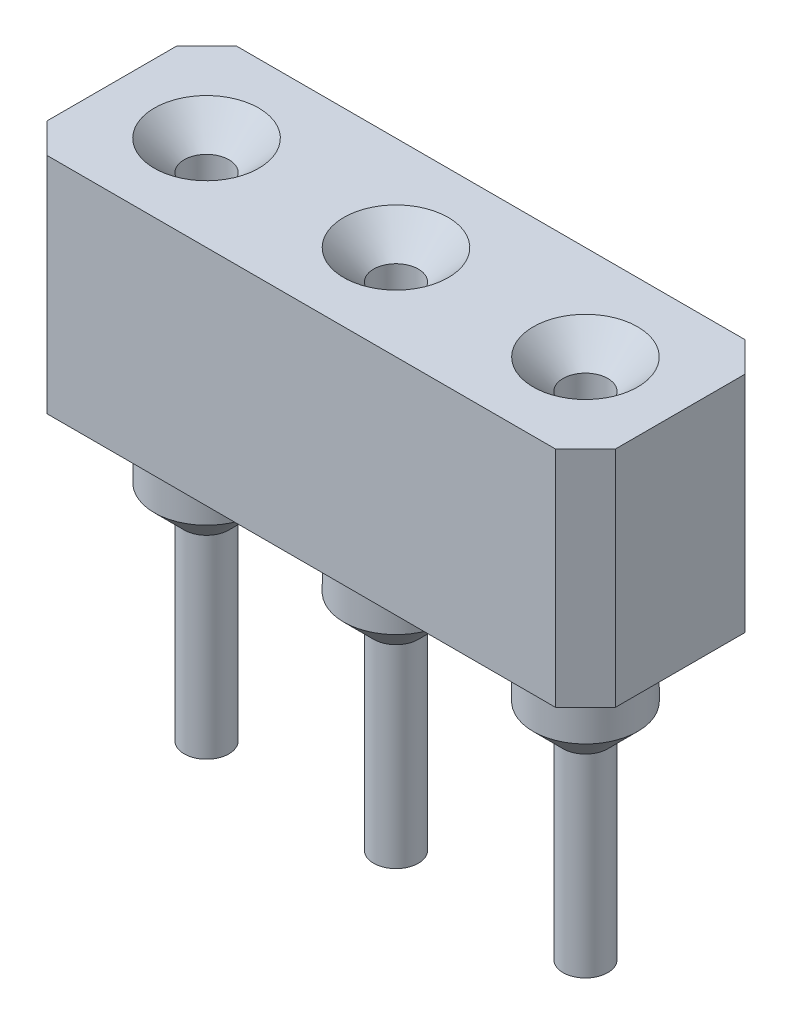
ISO-10303-21;
HEADER;
FILE_DESCRIPTION(('STEP AP214'),'2;1');
FILE_NAME('part.step','',(''),(''),'','','');
FILE_SCHEMA(('AUTOMOTIVE_DESIGN { 1 0 10303 214 1 1 1 1 }'));
ENDSEC;
DATA;
#1=APPLICATION_CONTEXT('core data for automotive mechanical design processes');
#2=APPLICATION_PROTOCOL_DEFINITION('international standard','automotive_design',2000,#1);
#3=PRODUCT_CONTEXT('',#1,'mechanical');
#4=PRODUCT('Part','Part','',(#3));
#5=PRODUCT_RELATED_PRODUCT_CATEGORY('part','',(#4));
#6=PRODUCT_DEFINITION_FORMATION('','',#4);
#7=PRODUCT_DEFINITION_CONTEXT('part definition',#1,'design');
#8=PRODUCT_DEFINITION('design','',#6,#7);
#9=PRODUCT_DEFINITION_SHAPE('','',#8);
#10=(LENGTH_UNIT() NAMED_UNIT(*) SI_UNIT(.MILLI.,.METRE.));
#11=(NAMED_UNIT(*) PLANE_ANGLE_UNIT() SI_UNIT($,.RADIAN.));
#12=(NAMED_UNIT(*) SI_UNIT($,.STERADIAN.) SOLID_ANGLE_UNIT());
#13=UNCERTAINTY_MEASURE_WITH_UNIT(LENGTH_MEASURE(1.E-05),#10,'distance_accuracy_value','');
#14=(GEOMETRIC_REPRESENTATION_CONTEXT(3) GLOBAL_UNCERTAINTY_ASSIGNED_CONTEXT((#13)) GLOBAL_UNIT_ASSIGNED_CONTEXT((#10,
#11,#12)) REPRESENTATION_CONTEXT('',''));
#15=CARTESIAN_POINT('',(0.,0.,0.));
#16=DIRECTION('',(0.,0.,1.));
#17=DIRECTION('',(1.,0.,0.));
#18=AXIS2_PLACEMENT_3D('',#15,#16,#17);
#19=CARTESIAN_POINT('',(-3.81,3.,1.27));
#20=DIRECTION('',(1.,0.,0.));
#21=DIRECTION('',(0.,0.,-1.));
#22=AXIS2_PLACEMENT_3D('',#19,#20,#21);
#23=PLANE('',#22);
#24=DIRECTION('',(0.,0.,1.));
#25=VECTOR('',#24,1.);
#26=CARTESIAN_POINT('',(-3.81,3.,1.27));
#27=LINE('',#26,#25);
#28=CARTESIAN_POINT('',(-3.81,3.,-0.869999999999997));
#29=VERTEX_POINT('',#28);
#30=CARTESIAN_POINT('',(-3.81,3.,0.869999999999998));
#31=VERTEX_POINT('',#30);
#32=EDGE_CURVE('E104',#29,#31,#27,.T.);
#33=ORIENTED_EDGE('',*,*,#32,.F.);
#34=DIRECTION('',(0.,-1.,0.));
#35=VECTOR('',#34,1.);
#36=CARTESIAN_POINT('',(-3.81,3.,-0.869999999999997));
#37=LINE('',#36,#35);
#38=CARTESIAN_POINT('',(-3.81,0.,-0.869999999999997));
#39=VERTEX_POINT('',#38);
#40=EDGE_CURVE('E11',#29,#39,#37,.T.);
#41=ORIENTED_EDGE('',*,*,#40,.T.);
#42=DIRECTION('',(0.,0.,1.));
#43=VECTOR('',#42,1.);
#44=CARTESIAN_POINT('',(-3.81,0.,1.27));
#45=LINE('',#44,#43);
#46=CARTESIAN_POINT('',(-3.81,0.,0.869999999999998));
#47=VERTEX_POINT('',#46);
#48=EDGE_CURVE('E332',#39,#47,#45,.T.);
#49=ORIENTED_EDGE('',*,*,#48,.T.);
#50=DIRECTION('',(0.,1.,0.));
#51=VECTOR('',#50,1.);
#52=CARTESIAN_POINT('',(-3.81,3.,0.869999999999998));
#53=LINE('',#52,#51);
#54=EDGE_CURVE('E40',#47,#31,#53,.T.);
#55=ORIENTED_EDGE('',*,*,#54,.T.);
#56=EDGE_LOOP('',(#33,#41,#49,#55));
#57=FACE_BOUND('',#56,.T.);
#58=ADVANCED_FACE('F32',(#57),#23,.F.);
#59=CARTESIAN_POINT('',(-3.81,3.,1.27));
#60=DIRECTION('',(0.,0.,-1.));
#61=DIRECTION('',(-1.,0.,0.));
#62=AXIS2_PLACEMENT_3D('',#59,#60,#61);
#63=PLANE('',#62);
#64=DIRECTION('',(1.,0.,0.));
#65=VECTOR('',#64,1.);
#66=CARTESIAN_POINT('',(-3.81,0.,1.27));
#67=LINE('',#66,#65);
#68=CARTESIAN_POINT('',(-3.41,0.,1.27));
#69=VERTEX_POINT('',#68);
#70=CARTESIAN_POINT('',(3.41,0.,1.27));
#71=VERTEX_POINT('',#70);
#72=EDGE_CURVE('E146',#69,#71,#67,.T.);
#73=ORIENTED_EDGE('',*,*,#72,.T.);
#74=DIRECTION('',(0.,1.,0.));
#75=VECTOR('',#74,1.);
#76=CARTESIAN_POINT('',(3.41,3.,1.27));
#77=LINE('',#76,#75);
#78=CARTESIAN_POINT('',(3.41,3.,1.27));
#79=VERTEX_POINT('',#78);
#80=EDGE_CURVE('E140',#71,#79,#77,.T.);
#81=ORIENTED_EDGE('',*,*,#80,.T.);
#82=DIRECTION('',(1.,0.,0.));
#83=VECTOR('',#82,1.);
#84=CARTESIAN_POINT('',(-3.81,3.,1.27));
#85=LINE('',#84,#83);
#86=CARTESIAN_POINT('',(-3.41,3.,1.27));
#87=VERTEX_POINT('',#86);
#88=EDGE_CURVE('E117',#87,#79,#85,.T.);
#89=ORIENTED_EDGE('',*,*,#88,.F.);
#90=DIRECTION('',(0.,-1.,0.));
#91=VECTOR('',#90,1.);
#92=CARTESIAN_POINT('',(-3.41,3.,1.27));
#93=LINE('',#92,#91);
#94=EDGE_CURVE('E138',#87,#69,#93,.T.);
#95=ORIENTED_EDGE('',*,*,#94,.T.);
#96=EDGE_LOOP('',(#73,#81,#89,#95));
#97=FACE_BOUND('',#96,.T.);
#98=ADVANCED_FACE('F145',(#97),#63,.F.);
#99=CARTESIAN_POINT('',(3.81,3.,1.27));
#100=DIRECTION('',(-1.,0.,0.));
#101=DIRECTION('',(0.,0.,1.));
#102=AXIS2_PLACEMENT_3D('',#99,#100,#101);
#103=PLANE('',#102);
#104=DIRECTION('',(0.,0.,-1.));
#105=VECTOR('',#104,1.);
#106=CARTESIAN_POINT('',(3.81,0.,1.27));
#107=LINE('',#106,#105);
#108=CARTESIAN_POINT('',(3.81,0.,0.869999999999999));
#109=VERTEX_POINT('',#108);
#110=CARTESIAN_POINT('',(3.81,0.,-0.870000000000001));
#111=VERTEX_POINT('',#110);
#112=EDGE_CURVE('E191',#109,#111,#107,.T.);
#113=ORIENTED_EDGE('',*,*,#112,.T.);
#114=DIRECTION('',(0.,1.,0.));
#115=VECTOR('',#114,1.);
#116=CARTESIAN_POINT('',(3.81,3.,-0.870000000000001));
#117=LINE('',#116,#115);
#118=CARTESIAN_POINT('',(3.81,3.,-0.870000000000001));
#119=VERTEX_POINT('',#118);
#120=EDGE_CURVE('E136',#111,#119,#117,.T.);
#121=ORIENTED_EDGE('',*,*,#120,.T.);
#122=DIRECTION('',(0.,0.,-1.));
#123=VECTOR('',#122,1.);
#124=CARTESIAN_POINT('',(3.81,3.,1.27));
#125=LINE('',#124,#123);
#126=CARTESIAN_POINT('',(3.81,3.,0.869999999999999));
#127=VERTEX_POINT('',#126);
#128=EDGE_CURVE('E150',#127,#119,#125,.T.);
#129=ORIENTED_EDGE('',*,*,#128,.F.);
#130=DIRECTION('',(0.,-1.,0.));
#131=VECTOR('',#130,1.);
#132=CARTESIAN_POINT('',(3.81,3.,0.869999999999999));
#133=LINE('',#132,#131);
#134=EDGE_CURVE('E133',#127,#109,#133,.T.);
#135=ORIENTED_EDGE('',*,*,#134,.T.);
#136=EDGE_LOOP('',(#113,#121,#129,#135));
#137=FACE_BOUND('',#136,.T.);
#138=ADVANCED_FACE('F234',(#137),#103,.F.);
#139=CARTESIAN_POINT('',(-3.81,3.,-1.27));
#140=DIRECTION('',(0.,0.,1.));
#141=DIRECTION('',(1.,0.,0.));
#142=AXIS2_PLACEMENT_3D('',#139,#140,#141);
#143=PLANE('',#142);
#144=DIRECTION('',(-1.,0.,0.));
#145=VECTOR('',#144,1.);
#146=CARTESIAN_POINT('',(-3.81,3.,-1.27));
#147=LINE('',#146,#145);
#148=CARTESIAN_POINT('',(3.41,3.,-1.27));
#149=VERTEX_POINT('',#148);
#150=CARTESIAN_POINT('',(-3.41,3.,-1.27));
#151=VERTEX_POINT('',#150);
#152=EDGE_CURVE('E107',#149,#151,#147,.T.);
#153=ORIENTED_EDGE('',*,*,#152,.F.);
#154=DIRECTION('',(0.,-1.,0.));
#155=VECTOR('',#154,1.);
#156=CARTESIAN_POINT('',(3.41,3.,-1.27));
#157=LINE('',#156,#155);
#158=CARTESIAN_POINT('',(3.41,0.,-1.27));
#159=VERTEX_POINT('',#158);
#160=EDGE_CURVE('E128',#149,#159,#157,.T.);
#161=ORIENTED_EDGE('',*,*,#160,.T.);
#162=DIRECTION('',(-1.,0.,0.));
#163=VECTOR('',#162,1.);
#164=CARTESIAN_POINT('',(-3.81,0.,-1.27));
#165=LINE('',#164,#163);
#166=CARTESIAN_POINT('',(-3.41,0.,-1.27));
#167=VERTEX_POINT('',#166);
#168=EDGE_CURVE('E118',#159,#167,#165,.T.);
#169=ORIENTED_EDGE('',*,*,#168,.T.);
#170=DIRECTION('',(0.,1.,0.));
#171=VECTOR('',#170,1.);
#172=CARTESIAN_POINT('',(-3.41,3.,-1.27));
#173=LINE('',#172,#171);
#174=EDGE_CURVE('E122',#167,#151,#173,.T.);
#175=ORIENTED_EDGE('',*,*,#174,.T.);
#176=EDGE_LOOP('',(#153,#161,#169,#175));
#177=FACE_BOUND('',#176,.T.);
#178=ADVANCED_FACE('F186',(#177),#143,.F.);
#179=CARTESIAN_POINT('',(0.,3.,0.));
#180=DIRECTION('',(0.,-1.,0.));
#181=DIRECTION('',(0.,0.,-1.));
#182=AXIS2_PLACEMENT_3D('',#179,#180,#181);
#183=PLANE('',#182);
#184=CARTESIAN_POINT('',(2.54,3.,0.));
#185=DIRECTION('',(0.,-1.,0.));
#186=DIRECTION('',(0.,0.,-1.));
#187=AXIS2_PLACEMENT_3D('',#184,#185,#186);
#188=CIRCLE('',#187,0.700000000000003);
#189=CARTESIAN_POINT('',(2.54,3.,-0.700000000000003));
#190=VERTEX_POINT('',#189);
#191=EDGE_CURVE('E165',#190,#190,#188,.T.);
#192=ORIENTED_EDGE('',*,*,#191,.T.);
#193=EDGE_LOOP('',(#192));
#194=FACE_BOUND('',#193,.T.);
#195=CARTESIAN_POINT('',(0.,3.,0.));
#196=DIRECTION('',(0.,-1.,0.));
#197=DIRECTION('',(0.,0.,-1.));
#198=AXIS2_PLACEMENT_3D('',#195,#196,#197);
#199=CIRCLE('',#198,0.700000000000003);
#200=CARTESIAN_POINT('',(0.,3.,-0.700000000000003));
#201=VERTEX_POINT('',#200);
#202=EDGE_CURVE('E162',#201,#201,#199,.T.);
#203=ORIENTED_EDGE('',*,*,#202,.T.);
#204=EDGE_LOOP('',(#203));
#205=FACE_BOUND('',#204,.T.);
#206=CARTESIAN_POINT('',(-2.54,3.,0.));
#207=DIRECTION('',(0.,-1.,0.));
#208=DIRECTION('',(0.,0.,-1.));
#209=AXIS2_PLACEMENT_3D('',#206,#207,#208);
#210=CIRCLE('',#209,0.700000000000003);
#211=CARTESIAN_POINT('',(-2.54,3.,-0.700000000000003));
#212=VERTEX_POINT('',#211);
#213=EDGE_CURVE('E156',#212,#212,#210,.T.);
#214=ORIENTED_EDGE('',*,*,#213,.T.);
#215=EDGE_LOOP('',(#214));
#216=FACE_BOUND('',#215,.T.);
#217=ORIENTED_EDGE('',*,*,#128,.T.);
#218=DIRECTION('',(0.707106781186548,0.,0.707106781186548));
#219=VECTOR('',#218,1.);
#220=CARTESIAN_POINT('',(3.41,3.,-1.27));
#221=LINE('',#220,#219);
#222=EDGE_CURVE('E154',#119,#149,#221,.F.);
#223=ORIENTED_EDGE('',*,*,#222,.T.);
#224=ORIENTED_EDGE('',*,*,#152,.T.);
#225=DIRECTION('',(0.707106781186548,0.,-0.707106781186547));
#226=VECTOR('',#225,1.);
#227=CARTESIAN_POINT('',(-3.81,3.,-0.869999999999997));
#228=LINE('',#227,#226);
#229=EDGE_CURVE('E100',#151,#29,#228,.F.);
#230=ORIENTED_EDGE('',*,*,#229,.T.);
#231=ORIENTED_EDGE('',*,*,#32,.T.);
#232=DIRECTION('',(-0.707106781186547,0.,-0.707106781186548));
#233=VECTOR('',#232,1.);
#234=CARTESIAN_POINT('',(-3.41,3.,1.27));
#235=LINE('',#234,#233);
#236=EDGE_CURVE('E112',#31,#87,#235,.F.);
#237=ORIENTED_EDGE('',*,*,#236,.T.);
#238=ORIENTED_EDGE('',*,*,#88,.T.);
#239=DIRECTION('',(-0.707106781186548,0.,0.707106781186547));
#240=VECTOR('',#239,1.);
#241=CARTESIAN_POINT('',(3.81,3.,0.869999999999999));
#242=LINE('',#241,#240);
#243=EDGE_CURVE('E111',#79,#127,#242,.F.);
#244=ORIENTED_EDGE('',*,*,#243,.T.);
#245=EDGE_LOOP('',(#217,#223,#224,#230,#231,#237,#238,#244));
#246=FACE_BOUND('',#245,.T.);
#247=ADVANCED_FACE('F103',(#194,#205,#216,#246),#183,.F.);
#248=CARTESIAN_POINT('',(0.,0.,0.));
#249=DIRECTION('',(0.,-1.,0.));
#250=DIRECTION('',(0.,0.,-1.));
#251=AXIS2_PLACEMENT_3D('',#248,#249,#250);
#252=PLANE('',#251);
#253=CARTESIAN_POINT('',(2.54,0.,0.));
#254=DIRECTION('',(0.,-1.,0.));
#255=DIRECTION('',(0.,0.,-1.));
#256=AXIS2_PLACEMENT_3D('',#253,#254,#255);
#257=CIRCLE('',#256,0.700000000000001);
#258=CARTESIAN_POINT('',(2.54,0.,-0.700000000000001));
#259=VERTEX_POINT('',#258);
#260=EDGE_CURVE('E202',#259,#259,#257,.T.);
#261=ORIENTED_EDGE('',*,*,#260,.F.);
#262=EDGE_LOOP('',(#261));
#263=FACE_BOUND('',#262,.T.);
#264=CARTESIAN_POINT('',(0.,0.,0.));
#265=DIRECTION('',(0.,-1.,0.));
#266=DIRECTION('',(0.,0.,-1.));
#267=AXIS2_PLACEMENT_3D('',#264,#265,#266);
#268=CIRCLE('',#267,0.700000000000001);
#269=CARTESIAN_POINT('',(0.,0.,-0.700000000000001));
#270=VERTEX_POINT('',#269);
#271=EDGE_CURVE('E199',#270,#270,#268,.T.);
#272=ORIENTED_EDGE('',*,*,#271,.F.);
#273=EDGE_LOOP('',(#272));
#274=FACE_BOUND('',#273,.T.);
#275=CARTESIAN_POINT('',(-2.54,0.,0.));
#276=DIRECTION('',(0.,-1.,0.));
#277=DIRECTION('',(0.,0.,-1.));
#278=AXIS2_PLACEMENT_3D('',#275,#276,#277);
#279=CIRCLE('',#278,0.7);
#280=CARTESIAN_POINT('',(-2.54,0.,-0.700000000000001));
#281=VERTEX_POINT('',#280);
#282=EDGE_CURVE('E196',#281,#281,#279,.T.);
#283=ORIENTED_EDGE('',*,*,#282,.F.);
#284=EDGE_LOOP('',(#283));
#285=FACE_BOUND('',#284,.T.);
#286=ORIENTED_EDGE('',*,*,#168,.F.);
#287=DIRECTION('',(-0.707106781186548,0.,-0.707106781186548));
#288=VECTOR('',#287,1.);
#289=CARTESIAN_POINT('',(2.34,0.,-2.34));
#290=LINE('',#289,#288);
#291=EDGE_CURVE('E126',#159,#111,#290,.F.);
#292=ORIENTED_EDGE('',*,*,#291,.T.);
#293=ORIENTED_EDGE('',*,*,#112,.F.);
#294=DIRECTION('',(0.707106781186548,0.,-0.707106781186547));
#295=VECTOR('',#294,1.);
#296=CARTESIAN_POINT('',(2.33999999999999,0.,2.34));
#297=LINE('',#296,#295);
#298=EDGE_CURVE('E47',#109,#71,#297,.F.);
#299=ORIENTED_EDGE('',*,*,#298,.T.);
#300=ORIENTED_EDGE('',*,*,#72,.F.);
#301=DIRECTION('',(0.707106781186547,0.,0.707106781186548));
#302=VECTOR('',#301,1.);
#303=CARTESIAN_POINT('',(-2.34,0.,2.34));
#304=LINE('',#303,#302);
#305=EDGE_CURVE('E55',#69,#47,#304,.F.);
#306=ORIENTED_EDGE('',*,*,#305,.T.);
#307=ORIENTED_EDGE('',*,*,#48,.F.);
#308=DIRECTION('',(-0.707106781186548,0.,0.707106781186547));
#309=VECTOR('',#308,1.);
#310=CARTESIAN_POINT('',(-2.33999999999999,0.,-2.34));
#311=LINE('',#310,#309);
#312=EDGE_CURVE('E121',#39,#167,#311,.F.);
#313=ORIENTED_EDGE('',*,*,#312,.T.);
#314=EDGE_LOOP('',(#286,#292,#293,#299,#300,#306,#307,#313));
#315=FACE_BOUND('',#314,.T.);
#316=ADVANCED_FACE('F189',(#263,#274,#285,#315),#252,.T.);
#317=CARTESIAN_POINT('',(0.,1.,0.));
#318=DIRECTION('',(0.,1.,0.));
#319=DIRECTION('',(0.,0.,1.));
#320=AXIS2_PLACEMENT_3D('',#317,#318,#319);
#321=CYLINDRICAL_SURFACE('',#320,0.3);
#322=CARTESIAN_POINT('',(0.,2.6,0.));
#323=DIRECTION('',(0.,-1.,0.));
#324=DIRECTION('',(0.,0.,-1.));
#325=AXIS2_PLACEMENT_3D('',#322,#323,#324);
#326=CIRCLE('',#325,0.3);
#327=CARTESIAN_POINT('',(0.,2.6,-0.3));
#328=VERTEX_POINT('',#327);
#329=EDGE_CURVE('E168',#328,#328,#326,.F.);
#330=ORIENTED_EDGE('',*,*,#329,.T.);
#331=EDGE_LOOP('',(#330));
#332=FACE_BOUND('',#331,.T.);
#333=CARTESIAN_POINT('',(0.,1.,0.));
#334=DIRECTION('',(0.,1.,0.));
#335=DIRECTION('',(0.,0.,1.));
#336=AXIS2_PLACEMENT_3D('',#333,#334,#335);
#337=CIRCLE('',#336,0.3);
#338=CARTESIAN_POINT('',(0.,1.,0.3));
#339=VERTEX_POINT('',#338);
#340=EDGE_CURVE('E328',#339,#339,#337,.T.);
#341=ORIENTED_EDGE('',*,*,#340,.F.);
#342=EDGE_LOOP('',(#341));
#343=FACE_BOUND('',#342,.T.);
#344=ADVANCED_FACE('F244',(#332,#343),#321,.F.);
#345=CARTESIAN_POINT('',(0.,1.,0.));
#346=DIRECTION('',(0.,1.,0.));
#347=DIRECTION('',(0.,0.,1.));
#348=AXIS2_PLACEMENT_3D('',#345,#346,#347);
#349=PLANE('',#348);
#350=ORIENTED_EDGE('',*,*,#340,.T.);
#351=EDGE_LOOP('',(#350));
#352=FACE_BOUND('',#351,.T.);
#353=ADVANCED_FACE('F251',(#352),#349,.T.);
#354=CARTESIAN_POINT('',(2.54,1.,0.));
#355=DIRECTION('',(0.,1.,0.));
#356=DIRECTION('',(0.,0.,1.));
#357=AXIS2_PLACEMENT_3D('',#354,#355,#356);
#358=CYLINDRICAL_SURFACE('',#357,0.3);
#359=CARTESIAN_POINT('',(2.54,2.6,0.));
#360=DIRECTION('',(0.,-1.,0.));
#361=DIRECTION('',(0.,0.,-1.));
#362=AXIS2_PLACEMENT_3D('',#359,#360,#361);
#363=CIRCLE('',#362,0.3);
#364=CARTESIAN_POINT('',(2.54,2.6,-0.3));
#365=VERTEX_POINT('',#364);
#366=EDGE_CURVE('E205',#365,#365,#363,.F.);
#367=ORIENTED_EDGE('',*,*,#366,.T.);
#368=EDGE_LOOP('',(#367));
#369=FACE_BOUND('',#368,.T.);
#370=CARTESIAN_POINT('',(2.54,1.,0.));
#371=DIRECTION('',(0.,1.,0.));
#372=DIRECTION('',(0.,0.,1.));
#373=AXIS2_PLACEMENT_3D('',#370,#371,#372);
#374=CIRCLE('',#373,0.3);
#375=CARTESIAN_POINT('',(2.54,1.,0.3));
#376=VERTEX_POINT('',#375);
#377=EDGE_CURVE('E325',#376,#376,#374,.T.);
#378=ORIENTED_EDGE('',*,*,#377,.F.);
#379=EDGE_LOOP('',(#378));
#380=FACE_BOUND('',#379,.T.);
#381=ADVANCED_FACE('F209',(#369,#380),#358,.F.);
#382=CARTESIAN_POINT('',(2.54,1.,0.));
#383=DIRECTION('',(0.,1.,0.));
#384=DIRECTION('',(0.,0.,1.));
#385=AXIS2_PLACEMENT_3D('',#382,#383,#384);
#386=PLANE('',#385);
#387=ORIENTED_EDGE('',*,*,#377,.T.);
#388=EDGE_LOOP('',(#387));
#389=FACE_BOUND('',#388,.T.);
#390=ADVANCED_FACE('F260',(#389),#386,.T.);
#391=CARTESIAN_POINT('',(-2.54,1.,0.));
#392=DIRECTION('',(0.,1.,0.));
#393=DIRECTION('',(0.,0.,1.));
#394=AXIS2_PLACEMENT_3D('',#391,#392,#393);
#395=CYLINDRICAL_SURFACE('',#394,0.3);
#396=CARTESIAN_POINT('',(-2.54,2.6,0.));
#397=DIRECTION('',(0.,-1.,0.));
#398=DIRECTION('',(0.,0.,-1.));
#399=AXIS2_PLACEMENT_3D('',#396,#397,#398);
#400=CIRCLE('',#399,0.3);
#401=CARTESIAN_POINT('',(-2.54,2.6,-0.3));
#402=VERTEX_POINT('',#401);
#403=EDGE_CURVE('E177',#402,#402,#400,.F.);
#404=ORIENTED_EDGE('',*,*,#403,.T.);
#405=EDGE_LOOP('',(#404));
#406=FACE_BOUND('',#405,.T.);
#407=CARTESIAN_POINT('',(-2.54,1.,0.));
#408=DIRECTION('',(0.,1.,0.));
#409=DIRECTION('',(0.,0.,1.));
#410=AXIS2_PLACEMENT_3D('',#407,#408,#409);
#411=CIRCLE('',#410,0.3);
#412=CARTESIAN_POINT('',(-2.54,1.,0.3));
#413=VERTEX_POINT('',#412);
#414=EDGE_CURVE('E324',#413,#413,#411,.T.);
#415=ORIENTED_EDGE('',*,*,#414,.F.);
#416=EDGE_LOOP('',(#415));
#417=FACE_BOUND('',#416,.T.);
#418=ADVANCED_FACE('F256',(#406,#417),#395,.F.);
#419=CARTESIAN_POINT('',(-2.54,1.,0.));
#420=DIRECTION('',(0.,1.,0.));
#421=DIRECTION('',(0.,0.,1.));
#422=AXIS2_PLACEMENT_3D('',#419,#420,#421);
#423=PLANE('',#422);
#424=ORIENTED_EDGE('',*,*,#414,.T.);
#425=EDGE_LOOP('',(#424));
#426=FACE_BOUND('',#425,.T.);
#427=ADVANCED_FACE('F259',(#426),#423,.T.);
#428=CARTESIAN_POINT('',(-2.54,-1.,0.));
#429=DIRECTION('',(0.,1.,0.));
#430=DIRECTION('',(0.,0.,1.));
#431=AXIS2_PLACEMENT_3D('',#428,#429,#430);
#432=CYLINDRICAL_SURFACE('',#431,0.7);
#433=CARTESIAN_POINT('',(-2.54,-1.,0.));
#434=DIRECTION('',(0.,1.,0.));
#435=DIRECTION('',(0.,0.,1.));
#436=AXIS2_PLACEMENT_3D('',#433,#434,#435);
#437=CIRCLE('',#436,0.7);
#438=CARTESIAN_POINT('',(-2.54,-1.,0.7));
#439=VERTEX_POINT('',#438);
#440=EDGE_CURVE('E321',#439,#439,#437,.T.);
#441=ORIENTED_EDGE('',*,*,#440,.T.);
#442=EDGE_LOOP('',(#441));
#443=FACE_BOUND('',#442,.T.);
#444=ORIENTED_EDGE('',*,*,#282,.T.);
#445=EDGE_LOOP('',(#444));
#446=FACE_BOUND('',#445,.T.);
#447=ADVANCED_FACE('F264',(#443,#446),#432,.T.);
#448=CARTESIAN_POINT('',(0.,-1.,0.));
#449=DIRECTION('',(0.,1.,0.));
#450=DIRECTION('',(0.,0.,1.));
#451=AXIS2_PLACEMENT_3D('',#448,#449,#450);
#452=CYLINDRICAL_SURFACE('',#451,0.700000000000001);
#453=CARTESIAN_POINT('',(0.,-1.,0.));
#454=DIRECTION('',(0.,1.,0.));
#455=DIRECTION('',(0.,0.,1.));
#456=AXIS2_PLACEMENT_3D('',#453,#454,#455);
#457=CIRCLE('',#456,0.700000000000001);
#458=CARTESIAN_POINT('',(0.,-1.,0.7));
#459=VERTEX_POINT('',#458);
#460=EDGE_CURVE('E318',#459,#459,#457,.T.);
#461=ORIENTED_EDGE('',*,*,#460,.T.);
#462=EDGE_LOOP('',(#461));
#463=FACE_BOUND('',#462,.T.);
#464=ORIENTED_EDGE('',*,*,#271,.T.);
#465=EDGE_LOOP('',(#464));
#466=FACE_BOUND('',#465,.T.);
#467=ADVANCED_FACE('F273',(#463,#466),#452,.T.);
#468=CARTESIAN_POINT('',(2.54,-1.,0.));
#469=DIRECTION('',(0.,1.,0.));
#470=DIRECTION('',(0.,0.,1.));
#471=AXIS2_PLACEMENT_3D('',#468,#469,#470);
#472=CYLINDRICAL_SURFACE('',#471,0.700000000000001);
#473=CARTESIAN_POINT('',(2.54,-1.,0.));
#474=DIRECTION('',(0.,1.,0.));
#475=DIRECTION('',(0.,0.,1.));
#476=AXIS2_PLACEMENT_3D('',#473,#474,#475);
#477=CIRCLE('',#476,0.700000000000001);
#478=CARTESIAN_POINT('',(2.54,-1.,0.7));
#479=VERTEX_POINT('',#478);
#480=EDGE_CURVE('E315',#479,#479,#477,.T.);
#481=ORIENTED_EDGE('',*,*,#480,.T.);
#482=EDGE_LOOP('',(#481));
#483=FACE_BOUND('',#482,.T.);
#484=ORIENTED_EDGE('',*,*,#260,.T.);
#485=EDGE_LOOP('',(#484));
#486=FACE_BOUND('',#485,.T.);
#487=ADVANCED_FACE('F277',(#483,#486),#472,.T.);
#488=CARTESIAN_POINT('',(-2.54,-4.,0.));
#489=DIRECTION('',(0.,1.,0.));
#490=DIRECTION('',(0.,0.,1.));
#491=AXIS2_PLACEMENT_3D('',#488,#489,#490);
#492=CYLINDRICAL_SURFACE('',#491,0.3);
#493=CARTESIAN_POINT('',(-2.54,-1.4,0.));
#494=DIRECTION('',(0.,1.,0.));
#495=DIRECTION('',(0.,0.,1.));
#496=AXIS2_PLACEMENT_3D('',#493,#494,#495);
#497=CIRCLE('',#496,0.3);
#498=CARTESIAN_POINT('',(-2.54,-1.4,0.299999999999999));
#499=VERTEX_POINT('',#498);
#500=EDGE_CURVE('E180',#499,#499,#497,.F.);
#501=ORIENTED_EDGE('',*,*,#500,.T.);
#502=EDGE_LOOP('',(#501));
#503=FACE_BOUND('',#502,.T.);
#504=CARTESIAN_POINT('',(-2.54,-4.,0.));
#505=DIRECTION('',(0.,-1.,0.));
#506=DIRECTION('',(0.,0.,-1.));
#507=AXIS2_PLACEMENT_3D('',#504,#505,#506);
#508=CIRCLE('',#507,0.3);
#509=CARTESIAN_POINT('',(-2.54,-4.,-0.300000000000001));
#510=VERTEX_POINT('',#509);
#511=EDGE_CURVE('E310',#510,#510,#508,.T.);
#512=ORIENTED_EDGE('',*,*,#511,.F.);
#513=EDGE_LOOP('',(#512));
#514=FACE_BOUND('',#513,.T.);
#515=ADVANCED_FACE('F281',(#503,#514),#492,.T.);
#516=CARTESIAN_POINT('',(-2.54,-4.,0.));
#517=DIRECTION('',(0.,-1.,0.));
#518=DIRECTION('',(0.,0.,-1.));
#519=AXIS2_PLACEMENT_3D('',#516,#517,#518);
#520=PLANE('',#519);
#521=ORIENTED_EDGE('',*,*,#511,.T.);
#522=EDGE_LOOP('',(#521));
#523=FACE_BOUND('',#522,.T.);
#524=ADVANCED_FACE('F285',(#523),#520,.T.);
#525=CARTESIAN_POINT('',(0.,-4.,0.));
#526=DIRECTION('',(0.,1.,0.));
#527=DIRECTION('',(0.,0.,1.));
#528=AXIS2_PLACEMENT_3D('',#525,#526,#527);
#529=CYLINDRICAL_SURFACE('',#528,0.3);
#530=CARTESIAN_POINT('',(0.,-1.4,0.));
#531=DIRECTION('',(0.,1.,0.));
#532=DIRECTION('',(0.,0.,1.));
#533=AXIS2_PLACEMENT_3D('',#530,#531,#532);
#534=CIRCLE('',#533,0.3);
#535=CARTESIAN_POINT('',(0.,-1.4,0.299999999999999));
#536=VERTEX_POINT('',#535);
#537=EDGE_CURVE('E174',#536,#536,#534,.F.);
#538=ORIENTED_EDGE('',*,*,#537,.T.);
#539=EDGE_LOOP('',(#538));
#540=FACE_BOUND('',#539,.T.);
#541=CARTESIAN_POINT('',(0.,-4.,0.));
#542=DIRECTION('',(0.,-1.,0.));
#543=DIRECTION('',(0.,0.,-1.));
#544=AXIS2_PLACEMENT_3D('',#541,#542,#543);
#545=CIRCLE('',#544,0.3);
#546=CARTESIAN_POINT('',(0.,-4.,-0.300000000000001));
#547=VERTEX_POINT('',#546);
#548=EDGE_CURVE('E307',#547,#547,#545,.T.);
#549=ORIENTED_EDGE('',*,*,#548,.F.);
#550=EDGE_LOOP('',(#549));
#551=FACE_BOUND('',#550,.T.);
#552=ADVANCED_FACE('F289',(#540,#551),#529,.T.);
#553=CARTESIAN_POINT('',(0.,-4.,0.));
#554=DIRECTION('',(0.,-1.,0.));
#555=DIRECTION('',(0.,0.,-1.));
#556=AXIS2_PLACEMENT_3D('',#553,#554,#555);
#557=PLANE('',#556);
#558=ORIENTED_EDGE('',*,*,#548,.T.);
#559=EDGE_LOOP('',(#558));
#560=FACE_BOUND('',#559,.T.);
#561=ADVANCED_FACE('F293',(#560),#557,.T.);
#562=CARTESIAN_POINT('',(2.54,-4.,0.));
#563=DIRECTION('',(0.,1.,0.));
#564=DIRECTION('',(0.,0.,1.));
#565=AXIS2_PLACEMENT_3D('',#562,#563,#564);
#566=CYLINDRICAL_SURFACE('',#565,0.3);
#567=CARTESIAN_POINT('',(2.54,-1.4,0.));
#568=DIRECTION('',(0.,1.,0.));
#569=DIRECTION('',(0.,0.,1.));
#570=AXIS2_PLACEMENT_3D('',#567,#568,#569);
#571=CIRCLE('',#570,0.3);
#572=CARTESIAN_POINT('',(2.54,-1.4,0.299999999999999));
#573=VERTEX_POINT('',#572);
#574=EDGE_CURVE('E171',#573,#573,#571,.F.);
#575=ORIENTED_EDGE('',*,*,#574,.T.);
#576=EDGE_LOOP('',(#575));
#577=FACE_BOUND('',#576,.T.);
#578=CARTESIAN_POINT('',(2.54,-4.,0.));
#579=DIRECTION('',(0.,-1.,0.));
#580=DIRECTION('',(0.,0.,-1.));
#581=AXIS2_PLACEMENT_3D('',#578,#579,#580);
#582=CIRCLE('',#581,0.3);
#583=CARTESIAN_POINT('',(2.54,-4.,-0.300000000000001));
#584=VERTEX_POINT('',#583);
#585=EDGE_CURVE('E306',#584,#584,#582,.T.);
#586=ORIENTED_EDGE('',*,*,#585,.F.);
#587=EDGE_LOOP('',(#586));
#588=FACE_BOUND('',#587,.T.);
#589=ADVANCED_FACE('F225',(#577,#588),#566,.T.);
#590=CARTESIAN_POINT('',(2.54,-4.,0.));
#591=DIRECTION('',(0.,-1.,0.));
#592=DIRECTION('',(0.,0.,-1.));
#593=AXIS2_PLACEMENT_3D('',#590,#591,#592);
#594=PLANE('',#593);
#595=ORIENTED_EDGE('',*,*,#585,.T.);
#596=EDGE_LOOP('',(#595));
#597=FACE_BOUND('',#596,.T.);
#598=ADVANCED_FACE('F215',(#597),#594,.T.);
#599=CARTESIAN_POINT('',(2.54,2.6,0.));
#600=DIRECTION('',(0.,1.,0.));
#601=DIRECTION('',(0.,0.,1.));
#602=AXIS2_PLACEMENT_3D('',#599,#600,#601);
#603=CONICAL_SURFACE('',#602,0.3,0.78539816339745);
#604=ORIENTED_EDGE('',*,*,#191,.F.);
#605=EDGE_LOOP('',(#604));
#606=FACE_BOUND('',#605,.T.);
#607=ORIENTED_EDGE('',*,*,#366,.F.);
#608=EDGE_LOOP('',(#607));
#609=FACE_BOUND('',#608,.T.);
#610=ADVANCED_FACE('F212',(#606,#609),#603,.F.);
#611=CARTESIAN_POINT('',(0.,2.6,0.));
#612=DIRECTION('',(0.,1.,0.));
#613=DIRECTION('',(0.,0.,1.));
#614=AXIS2_PLACEMENT_3D('',#611,#612,#613);
#615=CONICAL_SURFACE('',#614,0.3,0.78539816339745);
#616=ORIENTED_EDGE('',*,*,#202,.F.);
#617=EDGE_LOOP('',(#616));
#618=FACE_BOUND('',#617,.T.);
#619=ORIENTED_EDGE('',*,*,#329,.F.);
#620=EDGE_LOOP('',(#619));
#621=FACE_BOUND('',#620,.T.);
#622=ADVANCED_FACE('F214',(#618,#621),#615,.F.);
#623=CARTESIAN_POINT('',(2.54,-1.4,0.));
#624=DIRECTION('',(0.,1.,0.));
#625=DIRECTION('',(0.,0.,1.));
#626=AXIS2_PLACEMENT_3D('',#623,#624,#625);
#627=CONICAL_SURFACE('',#626,0.3,0.785398163397442);
#628=ORIENTED_EDGE('',*,*,#480,.F.);
#629=EDGE_LOOP('',(#628));
#630=FACE_BOUND('',#629,.T.);
#631=ORIENTED_EDGE('',*,*,#574,.F.);
#632=EDGE_LOOP('',(#631));
#633=FACE_BOUND('',#632,.T.);
#634=ADVANCED_FACE('F222',(#630,#633),#627,.T.);
#635=CARTESIAN_POINT('',(0.,-1.4,0.));
#636=DIRECTION('',(0.,1.,0.));
#637=DIRECTION('',(0.,0.,1.));
#638=AXIS2_PLACEMENT_3D('',#635,#636,#637);
#639=CONICAL_SURFACE('',#638,0.3,0.785398163397443);
#640=ORIENTED_EDGE('',*,*,#460,.F.);
#641=EDGE_LOOP('',(#640));
#642=FACE_BOUND('',#641,.T.);
#643=ORIENTED_EDGE('',*,*,#537,.F.);
#644=EDGE_LOOP('',(#643));
#645=FACE_BOUND('',#644,.T.);
#646=ADVANCED_FACE('F355',(#642,#645),#639,.T.);
#647=CARTESIAN_POINT('',(-2.54,2.6,0.));
#648=DIRECTION('',(0.,1.,0.));
#649=DIRECTION('',(0.,0.,1.));
#650=AXIS2_PLACEMENT_3D('',#647,#648,#649);
#651=CONICAL_SURFACE('',#650,0.3,0.78539816339745);
#652=ORIENTED_EDGE('',*,*,#213,.F.);
#653=EDGE_LOOP('',(#652));
#654=FACE_BOUND('',#653,.T.);
#655=ORIENTED_EDGE('',*,*,#403,.F.);
#656=EDGE_LOOP('',(#655));
#657=FACE_BOUND('',#656,.T.);
#658=ADVANCED_FACE('F351',(#654,#657),#651,.F.);
#659=CARTESIAN_POINT('',(-2.54,-1.4,0.));
#660=DIRECTION('',(0.,1.,0.));
#661=DIRECTION('',(0.,0.,1.));
#662=AXIS2_PLACEMENT_3D('',#659,#660,#661);
#663=CONICAL_SURFACE('',#662,0.3,0.785398163397442);
#664=ORIENTED_EDGE('',*,*,#440,.F.);
#665=EDGE_LOOP('',(#664));
#666=FACE_BOUND('',#665,.T.);
#667=ORIENTED_EDGE('',*,*,#500,.F.);
#668=EDGE_LOOP('',(#667));
#669=FACE_BOUND('',#668,.T.);
#670=ADVANCED_FACE('F348',(#666,#669),#663,.T.);
#671=CARTESIAN_POINT('',(3.41,3.,-1.27));
#672=DIRECTION('',(-0.707106781186547,0.,0.707106781186547));
#673=DIRECTION('',(0.,-1.,0.));
#674=AXIS2_PLACEMENT_3D('',#671,#672,#673);
#675=PLANE('',#674);
#676=ORIENTED_EDGE('',*,*,#222,.F.);
#677=ORIENTED_EDGE('',*,*,#120,.F.);
#678=ORIENTED_EDGE('',*,*,#291,.F.);
#679=ORIENTED_EDGE('',*,*,#160,.F.);
#680=EDGE_LOOP('',(#676,#677,#678,#679));
#681=FACE_BOUND('',#680,.T.);
#682=ADVANCED_FACE('F343',(#681),#675,.F.);
#683=CARTESIAN_POINT('',(3.81,3.,0.869999999999999));
#684=DIRECTION('',(-0.707106781186547,0.,-0.707106781186548));
#685=DIRECTION('',(0.,-1.,0.));
#686=AXIS2_PLACEMENT_3D('',#683,#684,#685);
#687=PLANE('',#686);
#688=ORIENTED_EDGE('',*,*,#243,.F.);
#689=ORIENTED_EDGE('',*,*,#80,.F.);
#690=ORIENTED_EDGE('',*,*,#298,.F.);
#691=ORIENTED_EDGE('',*,*,#134,.F.);
#692=EDGE_LOOP('',(#688,#689,#690,#691));
#693=FACE_BOUND('',#692,.T.);
#694=ADVANCED_FACE('F153',(#693),#687,.F.);
#695=CARTESIAN_POINT('',(-3.81,3.,-0.869999999999997));
#696=DIRECTION('',(0.707106781186547,0.,0.707106781186548));
#697=DIRECTION('',(0.,-1.,0.));
#698=AXIS2_PLACEMENT_3D('',#695,#696,#697);
#699=PLANE('',#698);
#700=ORIENTED_EDGE('',*,*,#229,.F.);
#701=ORIENTED_EDGE('',*,*,#174,.F.);
#702=ORIENTED_EDGE('',*,*,#312,.F.);
#703=ORIENTED_EDGE('',*,*,#40,.F.);
#704=EDGE_LOOP('',(#700,#701,#702,#703));
#705=FACE_BOUND('',#704,.T.);
#706=ADVANCED_FACE('F120',(#705),#699,.F.);
#707=CARTESIAN_POINT('',(-3.41,3.,1.27));
#708=DIRECTION('',(0.707106781186548,0.,-0.707106781186547));
#709=DIRECTION('',(0.,-1.,0.));
#710=AXIS2_PLACEMENT_3D('',#707,#708,#709);
#711=PLANE('',#710);
#712=ORIENTED_EDGE('',*,*,#236,.F.);
#713=ORIENTED_EDGE('',*,*,#54,.F.);
#714=ORIENTED_EDGE('',*,*,#305,.F.);
#715=ORIENTED_EDGE('',*,*,#94,.F.);
#716=EDGE_LOOP('',(#712,#713,#714,#715));
#717=FACE_BOUND('',#716,.T.);
#718=ADVANCED_FACE('F34',(#717),#711,.F.);
#719=CLOSED_SHELL('',(#58,#98,#138,#178,#247,#316,#344,#353,#381,#390,#418,#427,#447,#467,#487,
#515,#524,#552,#561,#589,#598,#610,#622,#634,#646,#658,#670,#682,#694,#706,#718));
#720=MANIFOLD_SOLID_BREP('B2',#719);
#721=ADVANCED_BREP_SHAPE_REPRESENTATION('',(#18,#720),#14);
#722=SHAPE_DEFINITION_REPRESENTATION(#9,#721);
ENDSEC;
END-ISO-10303-21;
